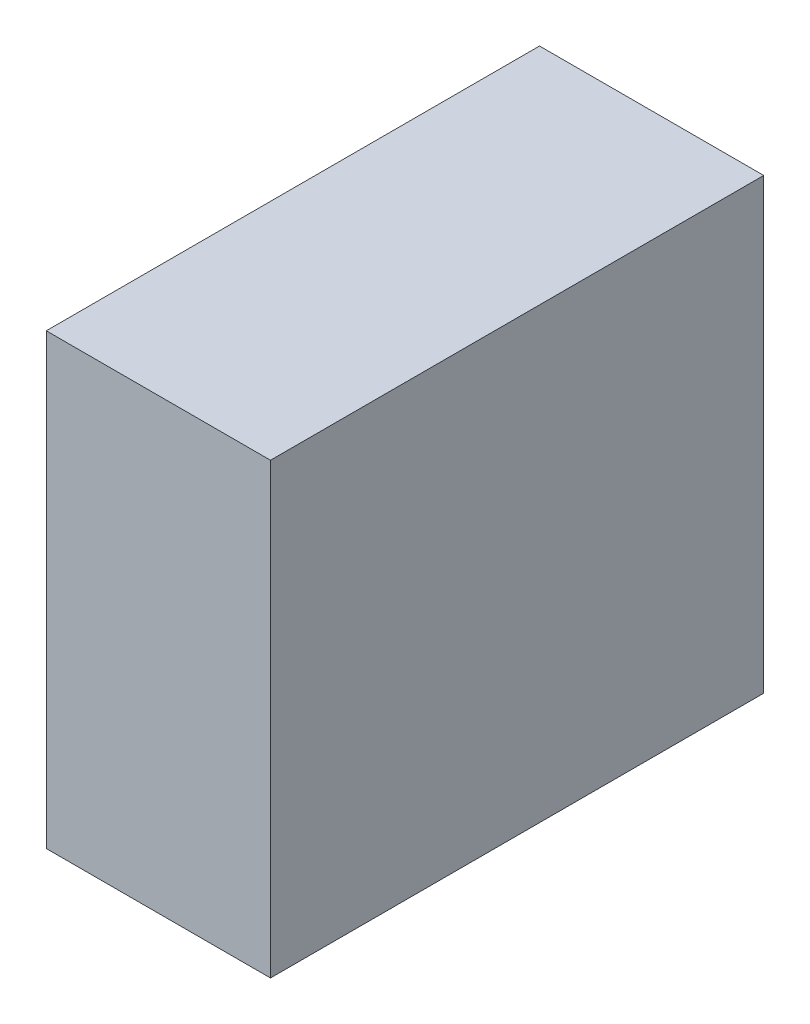
ISO-10303-21;
HEADER;
FILE_DESCRIPTION(('STEP AP214'),'2;1');
FILE_NAME('part.step','',(''),(''),'','','');
FILE_SCHEMA(('AUTOMOTIVE_DESIGN { 1 0 10303 214 1 1 1 1 }'));
ENDSEC;
DATA;
#1=APPLICATION_CONTEXT('core data for automotive mechanical design processes');
#2=APPLICATION_PROTOCOL_DEFINITION('international standard','automotive_design',2000,#1);
#3=PRODUCT_CONTEXT('',#1,'mechanical');
#4=PRODUCT('Part','Part','',(#3));
#5=PRODUCT_RELATED_PRODUCT_CATEGORY('part','',(#4));
#6=PRODUCT_DEFINITION_FORMATION('','',#4);
#7=PRODUCT_DEFINITION_CONTEXT('part definition',#1,'design');
#8=PRODUCT_DEFINITION('design','',#6,#7);
#9=PRODUCT_DEFINITION_SHAPE('','',#8);
#10=(LENGTH_UNIT() NAMED_UNIT(*) SI_UNIT(.MILLI.,.METRE.));
#11=(NAMED_UNIT(*) PLANE_ANGLE_UNIT() SI_UNIT($,.RADIAN.));
#12=(NAMED_UNIT(*) SI_UNIT($,.STERADIAN.) SOLID_ANGLE_UNIT());
#13=UNCERTAINTY_MEASURE_WITH_UNIT(LENGTH_MEASURE(1.E-05),#10,'distance_accuracy_value','');
#14=(GEOMETRIC_REPRESENTATION_CONTEXT(3) GLOBAL_UNCERTAINTY_ASSIGNED_CONTEXT((#13)) GLOBAL_UNIT_ASSIGNED_CONTEXT((#10,
#11,#12)) REPRESENTATION_CONTEXT('',''));
#15=CARTESIAN_POINT('',(0.,0.,0.));
#16=DIRECTION('',(0.,0.,1.));
#17=DIRECTION('',(1.,0.,0.));
#18=AXIS2_PLACEMENT_3D('',#15,#16,#17);
#19=CARTESIAN_POINT('',(-4.725000000047,0.15,2.502777778308));
#20=DIRECTION('',(1.,0.,0.));
#21=DIRECTION('',(0.,0.,-1.));
#22=AXIS2_PLACEMENT_3D('',#19,#20,#21);
#23=PLANE('',#22);
#24=DIRECTION('',(0.,1.,0.));
#25=VECTOR('',#24,1.);
#26=CARTESIAN_POINT('',(-4.725000000047,0.,2.502777778308));
#27=LINE('',#26,#25);
#28=CARTESIAN_POINT('',(-4.725000000047,-0.15,2.502777778308));
#29=VERTEX_POINT('',#28);
#30=CARTESIAN_POINT('',(-4.725000000047,0.15,2.502777778308));
#31=VERTEX_POINT('',#30);
#32=EDGE_CURVE('E55',#29,#31,#27,.T.);
#33=ORIENTED_EDGE('',*,*,#32,.T.);
#34=DIRECTION('',(0.,0.,1.));
#35=VECTOR('',#34,1.);
#36=CARTESIAN_POINT('',(-4.725000000047,0.15,2.502777778308));
#37=LINE('',#36,#35);
#38=CARTESIAN_POINT('',(-4.725000000047,0.15,2.832777778308));
#39=VERTEX_POINT('',#38);
#40=EDGE_CURVE('E67',#39,#31,#37,.F.);
#41=ORIENTED_EDGE('',*,*,#40,.F.);
#42=DIRECTION('',(0.,1.,0.));
#43=VECTOR('',#42,1.);
#44=CARTESIAN_POINT('',(-4.725000000047,0.,2.832777778308));
#45=LINE('',#44,#43);
#46=CARTESIAN_POINT('',(-4.725000000047,-0.15,2.832777778308));
#47=VERTEX_POINT('',#46);
#48=EDGE_CURVE('E20',#39,#47,#45,.F.);
#49=ORIENTED_EDGE('',*,*,#48,.T.);
#50=DIRECTION('',(0.,0.,-1.));
#51=VECTOR('',#50,1.);
#52=CARTESIAN_POINT('',(-4.725000000047,-0.15,2.502777778308));
#53=LINE('',#52,#51);
#54=EDGE_CURVE('E81',#29,#47,#53,.F.);
#55=ORIENTED_EDGE('',*,*,#54,.F.);
#56=EDGE_LOOP('',(#33,#41,#49,#55));
#57=FACE_BOUND('',#56,.T.);
#58=ADVANCED_FACE('F17',(#57),#23,.T.);
#59=CARTESIAN_POINT('',(-4.800000000047,0.,2.832777778308));
#60=DIRECTION('',(0.,0.,-1.));
#61=DIRECTION('',(-1.,0.,0.));
#62=AXIS2_PLACEMENT_3D('',#59,#60,#61);
#63=PLANE('',#62);
#64=DIRECTION('',(1.,0.,0.));
#65=VECTOR('',#64,1.);
#66=CARTESIAN_POINT('',(-4.725000000047,-0.15,2.832777778308));
#67=LINE('',#66,#65);
#68=CARTESIAN_POINT('',(-4.875000000047,-0.15,2.832777778308));
#69=VERTEX_POINT('',#68);
#70=EDGE_CURVE('E65',#47,#69,#67,.F.);
#71=ORIENTED_EDGE('',*,*,#70,.F.);
#72=ORIENTED_EDGE('',*,*,#48,.F.);
#73=DIRECTION('',(1.,0.,0.));
#74=VECTOR('',#73,1.);
#75=CARTESIAN_POINT('',(-4.875000000047,0.15,2.832777778308));
#76=LINE('',#75,#74);
#77=CARTESIAN_POINT('',(-4.875000000047,0.15,2.832777778308));
#78=VERTEX_POINT('',#77);
#79=EDGE_CURVE('E62',#78,#39,#76,.T.);
#80=ORIENTED_EDGE('',*,*,#79,.F.);
#81=DIRECTION('',(0.,1.,0.));
#82=VECTOR('',#81,1.);
#83=CARTESIAN_POINT('',(-4.875000000047,-0.15,2.832777778308));
#84=LINE('',#83,#82);
#85=EDGE_CURVE('E83',#69,#78,#84,.T.);
#86=ORIENTED_EDGE('',*,*,#85,.F.);
#87=EDGE_LOOP('',(#71,#72,#80,#86));
#88=FACE_BOUND('',#87,.T.);
#89=ADVANCED_FACE('F60',(#88),#63,.F.);
#90=CARTESIAN_POINT('',(-4.875000000047,0.15,2.502777778308));
#91=DIRECTION('',(0.,1.,0.));
#92=DIRECTION('',(0.,0.,1.));
#93=AXIS2_PLACEMENT_3D('',#90,#91,#92);
#94=PLANE('',#93);
#95=DIRECTION('',(1.,0.,0.));
#96=VECTOR('',#95,1.);
#97=CARTESIAN_POINT('',(-4.800000000047,0.15,2.502777778308));
#98=LINE('',#97,#96);
#99=CARTESIAN_POINT('',(-4.875000000047,0.15,2.502777778308));
#100=VERTEX_POINT('',#99);
#101=EDGE_CURVE('E77',#31,#100,#98,.F.);
#102=ORIENTED_EDGE('',*,*,#101,.T.);
#103=DIRECTION('',(0.,0.,1.));
#104=VECTOR('',#103,1.);
#105=CARTESIAN_POINT('',(-4.875000000047,0.15,2.502777778308));
#106=LINE('',#105,#104);
#107=EDGE_CURVE('E73',#78,#100,#106,.F.);
#108=ORIENTED_EDGE('',*,*,#107,.F.);
#109=ORIENTED_EDGE('',*,*,#79,.T.);
#110=ORIENTED_EDGE('',*,*,#40,.T.);
#111=EDGE_LOOP('',(#102,#108,#109,#110));
#112=FACE_BOUND('',#111,.T.);
#113=ADVANCED_FACE('F71',(#112),#94,.T.);
#114=CARTESIAN_POINT('',(-4.800000000047,0.,2.502777778308));
#115=DIRECTION('',(0.,0.,1.));
#116=DIRECTION('',(1.,0.,0.));
#117=AXIS2_PLACEMENT_3D('',#114,#115,#116);
#118=PLANE('',#117);
#119=DIRECTION('',(0.,1.,0.));
#120=VECTOR('',#119,1.);
#121=CARTESIAN_POINT('',(-4.875000000047,-0.15,2.502777778308));
#122=LINE('',#121,#120);
#123=CARTESIAN_POINT('',(-4.875000000047,-0.15,2.502777778308));
#124=VERTEX_POINT('',#123);
#125=EDGE_CURVE('E26',#100,#124,#122,.F.);
#126=ORIENTED_EDGE('',*,*,#125,.F.);
#127=ORIENTED_EDGE('',*,*,#101,.F.);
#128=ORIENTED_EDGE('',*,*,#32,.F.);
#129=DIRECTION('',(1.,0.,0.));
#130=VECTOR('',#129,1.);
#131=CARTESIAN_POINT('',(-4.725000000047,-0.15,2.502777778308));
#132=LINE('',#131,#130);
#133=EDGE_CURVE('E35',#124,#29,#132,.T.);
#134=ORIENTED_EDGE('',*,*,#133,.F.);
#135=EDGE_LOOP('',(#126,#127,#128,#134));
#136=FACE_BOUND('',#135,.T.);
#137=ADVANCED_FACE('F89',(#136),#118,.F.);
#138=CARTESIAN_POINT('',(-4.725000000047,-0.15,2.502777778308));
#139=DIRECTION('',(0.,-1.,0.));
#140=DIRECTION('',(0.,0.,-1.));
#141=AXIS2_PLACEMENT_3D('',#138,#139,#140);
#142=PLANE('',#141);
#143=ORIENTED_EDGE('',*,*,#133,.T.);
#144=ORIENTED_EDGE('',*,*,#54,.T.);
#145=ORIENTED_EDGE('',*,*,#70,.T.);
#146=DIRECTION('',(0.,0.,1.));
#147=VECTOR('',#146,1.);
#148=CARTESIAN_POINT('',(-4.875000000047,-0.15,2.502777778308));
#149=LINE('',#148,#147);
#150=EDGE_CURVE('E11',#124,#69,#149,.T.);
#151=ORIENTED_EDGE('',*,*,#150,.F.);
#152=EDGE_LOOP('',(#143,#144,#145,#151));
#153=FACE_BOUND('',#152,.T.);
#154=ADVANCED_FACE('F91',(#153),#142,.T.);
#155=CARTESIAN_POINT('',(-4.875000000047,-0.15,2.502777778308));
#156=DIRECTION('',(-1.,0.,0.));
#157=DIRECTION('',(0.,0.,1.));
#158=AXIS2_PLACEMENT_3D('',#155,#156,#157);
#159=PLANE('',#158);
#160=ORIENTED_EDGE('',*,*,#125,.T.);
#161=ORIENTED_EDGE('',*,*,#150,.T.);
#162=ORIENTED_EDGE('',*,*,#85,.T.);
#163=ORIENTED_EDGE('',*,*,#107,.T.);
#164=EDGE_LOOP('',(#160,#161,#162,#163));
#165=FACE_BOUND('',#164,.T.);
#166=ADVANCED_FACE('F88',(#165),#159,.T.);
#167=CLOSED_SHELL('',(#58,#89,#113,#137,#154,#166));
#168=MANIFOLD_SOLID_BREP('B1',#167);
#169=ADVANCED_BREP_SHAPE_REPRESENTATION('',(#18,#168),#14);
#170=SHAPE_DEFINITION_REPRESENTATION(#9,#169);
ENDSEC;
END-ISO-10303-21;
